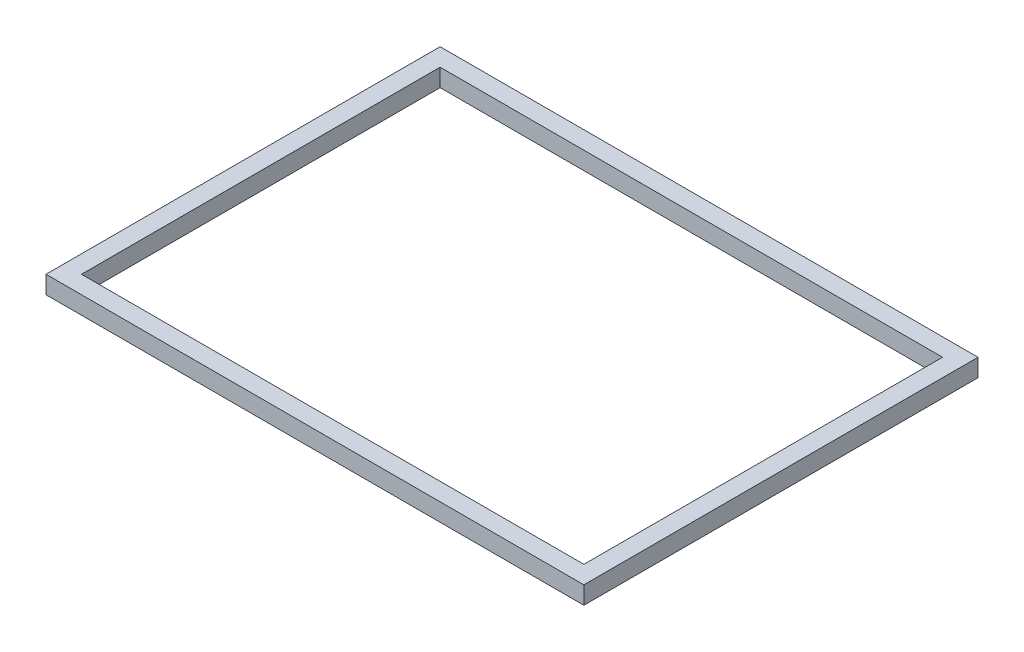
ISO-10303-21;
HEADER;
FILE_DESCRIPTION(('STEP AP214'),'2;1');
FILE_NAME('part.step','',(''),(''),'','','');
FILE_SCHEMA(('AUTOMOTIVE_DESIGN { 1 0 10303 214 1 1 1 1 }'));
ENDSEC;
DATA;
#1=APPLICATION_CONTEXT('core data for automotive mechanical design processes');
#2=APPLICATION_PROTOCOL_DEFINITION('international standard','automotive_design',2000,#1);
#3=PRODUCT_CONTEXT('',#1,'mechanical');
#4=PRODUCT('Part','Part','',(#3));
#5=PRODUCT_RELATED_PRODUCT_CATEGORY('part','',(#4));
#6=PRODUCT_DEFINITION_FORMATION('','',#4);
#7=PRODUCT_DEFINITION_CONTEXT('part definition',#1,'design');
#8=PRODUCT_DEFINITION('design','',#6,#7);
#9=PRODUCT_DEFINITION_SHAPE('','',#8);
#10=(LENGTH_UNIT() NAMED_UNIT(*) SI_UNIT(.MILLI.,.METRE.));
#11=(NAMED_UNIT(*) PLANE_ANGLE_UNIT() SI_UNIT($,.RADIAN.));
#12=(NAMED_UNIT(*) SI_UNIT($,.STERADIAN.) SOLID_ANGLE_UNIT());
#13=UNCERTAINTY_MEASURE_WITH_UNIT(LENGTH_MEASURE(1.E-05),#10,'distance_accuracy_value','');
#14=(GEOMETRIC_REPRESENTATION_CONTEXT(3) GLOBAL_UNCERTAINTY_ASSIGNED_CONTEXT((#13)) GLOBAL_UNIT_ASSIGNED_CONTEXT((#10,
#11,#12)) REPRESENTATION_CONTEXT('',''));
#15=CARTESIAN_POINT('',(0.,0.,0.));
#16=DIRECTION('',(0.,0.,1.));
#17=DIRECTION('',(1.,0.,0.));
#18=AXIS2_PLACEMENT_3D('',#15,#16,#17);
#19=CARTESIAN_POINT('',(0.,30.1625,0.));
#20=DIRECTION('',(0.,1.,0.));
#21=DIRECTION('',(0.,0.,1.));
#22=AXIS2_PLACEMENT_3D('',#19,#20,#21);
#23=PLANE('',#22);
#24=DIRECTION('',(0.,0.,-1.));
#25=VECTOR('',#24,1.);
#26=CARTESIAN_POINT('',(457.2,30.1625,-335.));
#27=LINE('',#26,#25);
#28=CARTESIAN_POINT('',(457.2,30.1625,335.));
#29=VERTEX_POINT('',#28);
#30=CARTESIAN_POINT('',(457.2,30.1625,-335.));
#31=VERTEX_POINT('',#30);
#32=EDGE_CURVE('E136',#29,#31,#27,.T.);
#33=ORIENTED_EDGE('',*,*,#32,.T.);
#34=DIRECTION('',(-1.,0.,0.));
#35=VECTOR('',#34,1.);
#36=CARTESIAN_POINT('',(-457.2,30.1625,-335.));
#37=LINE('',#36,#35);
#38=CARTESIAN_POINT('',(-457.2,30.1625,-335.));
#39=VERTEX_POINT('',#38);
#40=EDGE_CURVE('E139',#31,#39,#37,.T.);
#41=ORIENTED_EDGE('',*,*,#40,.T.);
#42=DIRECTION('',(0.,0.,1.));
#43=VECTOR('',#42,1.);
#44=CARTESIAN_POINT('',(-457.2,30.1625,-335.));
#45=LINE('',#44,#43);
#46=CARTESIAN_POINT('',(-457.2,30.1625,335.));
#47=VERTEX_POINT('',#46);
#48=EDGE_CURVE('E142',#39,#47,#45,.T.);
#49=ORIENTED_EDGE('',*,*,#48,.T.);
#50=DIRECTION('',(1.,0.,0.));
#51=VECTOR('',#50,1.);
#52=CARTESIAN_POINT('',(-457.2,30.1625,335.));
#53=LINE('',#52,#51);
#54=EDGE_CURVE('E144',#47,#29,#53,.T.);
#55=ORIENTED_EDGE('',*,*,#54,.T.);
#56=EDGE_LOOP('',(#33,#41,#49,#55));
#57=FACE_BOUND('',#56,.T.);
#58=DIRECTION('',(-1.,0.,0.));
#59=VECTOR('',#58,1.);
#60=CARTESIAN_POINT('',(-427.0375,30.1625,-304.8375));
#61=LINE('',#60,#59);
#62=CARTESIAN_POINT('',(427.0375,30.1625,-304.8375));
#63=VERTEX_POINT('',#62);
#64=CARTESIAN_POINT('',(-427.0375,30.1625,-304.8375));
#65=VERTEX_POINT('',#64);
#66=EDGE_CURVE('E108',#63,#65,#61,.T.);
#67=ORIENTED_EDGE('',*,*,#66,.F.);
#68=DIRECTION('',(0.,0.,-1.));
#69=VECTOR('',#68,1.);
#70=CARTESIAN_POINT('',(427.0375,30.1625,-304.8375));
#71=LINE('',#70,#69);
#72=CARTESIAN_POINT('',(427.0375,30.1625,304.8375));
#73=VERTEX_POINT('',#72);
#74=EDGE_CURVE('E100',#73,#63,#71,.T.);
#75=ORIENTED_EDGE('',*,*,#74,.F.);
#76=DIRECTION('',(1.,0.,0.));
#77=VECTOR('',#76,1.);
#78=CARTESIAN_POINT('',(-427.0375,30.1625,304.8375));
#79=LINE('',#78,#77);
#80=CARTESIAN_POINT('',(-427.0375,30.1625,304.8375));
#81=VERTEX_POINT('',#80);
#82=EDGE_CURVE('E122',#81,#73,#79,.T.);
#83=ORIENTED_EDGE('',*,*,#82,.F.);
#84=DIRECTION('',(0.,0.,1.));
#85=VECTOR('',#84,1.);
#86=CARTESIAN_POINT('',(-427.0375,30.1625,-304.8375));
#87=LINE('',#86,#85);
#88=EDGE_CURVE('E120',#65,#81,#87,.T.);
#89=ORIENTED_EDGE('',*,*,#88,.F.);
#90=EDGE_LOOP('',(#67,#75,#83,#89));
#91=FACE_BOUND('',#90,.T.);
#92=ADVANCED_FACE('F35',(#57,#91),#23,.T.);
#93=CARTESIAN_POINT('',(0.,0.,0.));
#94=DIRECTION('',(0.,1.,0.));
#95=DIRECTION('',(0.,0.,1.));
#96=AXIS2_PLACEMENT_3D('',#93,#94,#95);
#97=PLANE('',#96);
#98=DIRECTION('',(0.,0.,-1.));
#99=VECTOR('',#98,1.);
#100=CARTESIAN_POINT('',(457.2,0.,-335.));
#101=LINE('',#100,#99);
#102=CARTESIAN_POINT('',(457.2,0.,335.));
#103=VERTEX_POINT('',#102);
#104=CARTESIAN_POINT('',(457.2,0.,-335.));
#105=VERTEX_POINT('',#104);
#106=EDGE_CURVE('E116',#103,#105,#101,.T.);
#107=ORIENTED_EDGE('',*,*,#106,.F.);
#108=DIRECTION('',(1.,0.,0.));
#109=VECTOR('',#108,1.);
#110=CARTESIAN_POINT('',(-457.2,0.,335.));
#111=LINE('',#110,#109);
#112=CARTESIAN_POINT('',(-457.2,0.,335.));
#113=VERTEX_POINT('',#112);
#114=EDGE_CURVE('E140',#113,#103,#111,.T.);
#115=ORIENTED_EDGE('',*,*,#114,.F.);
#116=DIRECTION('',(0.,0.,1.));
#117=VECTOR('',#116,1.);
#118=CARTESIAN_POINT('',(-457.2,0.,-335.));
#119=LINE('',#118,#117);
#120=CARTESIAN_POINT('',(-457.2,0.,-335.));
#121=VERTEX_POINT('',#120);
#122=EDGE_CURVE('E151',#121,#113,#119,.T.);
#123=ORIENTED_EDGE('',*,*,#122,.F.);
#124=DIRECTION('',(-1.,0.,0.));
#125=VECTOR('',#124,1.);
#126=CARTESIAN_POINT('',(-457.2,0.,-335.));
#127=LINE('',#126,#125);
#128=EDGE_CURVE('E149',#105,#121,#127,.T.);
#129=ORIENTED_EDGE('',*,*,#128,.F.);
#130=EDGE_LOOP('',(#107,#115,#123,#129));
#131=FACE_BOUND('',#130,.T.);
#132=DIRECTION('',(0.,0.,-1.));
#133=VECTOR('',#132,1.);
#134=CARTESIAN_POINT('',(427.0375,0.,-304.8375));
#135=LINE('',#134,#133);
#136=CARTESIAN_POINT('',(427.0375,0.,304.8375));
#137=VERTEX_POINT('',#136);
#138=CARTESIAN_POINT('',(427.0375,0.,-304.8375));
#139=VERTEX_POINT('',#138);
#140=EDGE_CURVE('E58',#137,#139,#135,.T.);
#141=ORIENTED_EDGE('',*,*,#140,.T.);
#142=DIRECTION('',(-1.,0.,0.));
#143=VECTOR('',#142,1.);
#144=CARTESIAN_POINT('',(-427.0375,0.,-304.8375));
#145=LINE('',#144,#143);
#146=CARTESIAN_POINT('',(-427.0375,0.,-304.8375));
#147=VERTEX_POINT('',#146);
#148=EDGE_CURVE('E115',#139,#147,#145,.T.);
#149=ORIENTED_EDGE('',*,*,#148,.T.);
#150=DIRECTION('',(0.,0.,1.));
#151=VECTOR('',#150,1.);
#152=CARTESIAN_POINT('',(-427.0375,0.,-304.8375));
#153=LINE('',#152,#151);
#154=CARTESIAN_POINT('',(-427.0375,0.,304.8375));
#155=VERTEX_POINT('',#154);
#156=EDGE_CURVE('E128',#147,#155,#153,.T.);
#157=ORIENTED_EDGE('',*,*,#156,.T.);
#158=DIRECTION('',(1.,0.,0.));
#159=VECTOR('',#158,1.);
#160=CARTESIAN_POINT('',(-427.0375,0.,304.8375));
#161=LINE('',#160,#159);
#162=EDGE_CURVE('E109',#155,#137,#161,.T.);
#163=ORIENTED_EDGE('',*,*,#162,.T.);
#164=EDGE_LOOP('',(#141,#149,#157,#163));
#165=FACE_BOUND('',#164,.T.);
#166=ADVANCED_FACE('F169',(#131,#165),#97,.F.);
#167=CARTESIAN_POINT('',(457.2,30.1625,-335.));
#168=DIRECTION('',(-1.,0.,0.));
#169=DIRECTION('',(0.,0.,1.));
#170=AXIS2_PLACEMENT_3D('',#167,#168,#169);
#171=PLANE('',#170);
#172=ORIENTED_EDGE('',*,*,#106,.T.);
#173=DIRECTION('',(0.,-1.,0.));
#174=VECTOR('',#173,1.);
#175=CARTESIAN_POINT('',(457.2,30.1625,-335.));
#176=LINE('',#175,#174);
#177=EDGE_CURVE('E11',#31,#105,#176,.T.);
#178=ORIENTED_EDGE('',*,*,#177,.F.);
#179=ORIENTED_EDGE('',*,*,#32,.F.);
#180=DIRECTION('',(0.,-1.,0.));
#181=VECTOR('',#180,1.);
#182=CARTESIAN_POINT('',(457.2,30.1625,335.));
#183=LINE('',#182,#181);
#184=EDGE_CURVE('E146',#29,#103,#183,.T.);
#185=ORIENTED_EDGE('',*,*,#184,.T.);
#186=EDGE_LOOP('',(#172,#178,#179,#185));
#187=FACE_BOUND('',#186,.T.);
#188=ADVANCED_FACE('F37',(#187),#171,.F.);
#189=CARTESIAN_POINT('',(-457.2,30.1625,-335.));
#190=DIRECTION('',(0.,0.,1.));
#191=DIRECTION('',(1.,0.,0.));
#192=AXIS2_PLACEMENT_3D('',#189,#190,#191);
#193=PLANE('',#192);
#194=ORIENTED_EDGE('',*,*,#128,.T.);
#195=DIRECTION('',(0.,-1.,0.));
#196=VECTOR('',#195,1.);
#197=CARTESIAN_POINT('',(-457.2,30.1625,-335.));
#198=LINE('',#197,#196);
#199=EDGE_CURVE('E43',#39,#121,#198,.T.);
#200=ORIENTED_EDGE('',*,*,#199,.F.);
#201=ORIENTED_EDGE('',*,*,#40,.F.);
#202=ORIENTED_EDGE('',*,*,#177,.T.);
#203=EDGE_LOOP('',(#194,#200,#201,#202));
#204=FACE_BOUND('',#203,.T.);
#205=ADVANCED_FACE('F179',(#204),#193,.F.);
#206=CARTESIAN_POINT('',(-457.2,30.1625,-335.));
#207=DIRECTION('',(1.,0.,0.));
#208=DIRECTION('',(0.,0.,-1.));
#209=AXIS2_PLACEMENT_3D('',#206,#207,#208);
#210=PLANE('',#209);
#211=ORIENTED_EDGE('',*,*,#122,.T.);
#212=DIRECTION('',(0.,-1.,0.));
#213=VECTOR('',#212,1.);
#214=CARTESIAN_POINT('',(-457.2,30.1625,335.));
#215=LINE('',#214,#213);
#216=EDGE_CURVE('E156',#47,#113,#215,.T.);
#217=ORIENTED_EDGE('',*,*,#216,.F.);
#218=ORIENTED_EDGE('',*,*,#48,.F.);
#219=ORIENTED_EDGE('',*,*,#199,.T.);
#220=EDGE_LOOP('',(#211,#217,#218,#219));
#221=FACE_BOUND('',#220,.T.);
#222=ADVANCED_FACE('F163',(#221),#210,.F.);
#223=CARTESIAN_POINT('',(-457.2,30.1625,335.));
#224=DIRECTION('',(0.,0.,-1.));
#225=DIRECTION('',(-1.,0.,0.));
#226=AXIS2_PLACEMENT_3D('',#223,#224,#225);
#227=PLANE('',#226);
#228=ORIENTED_EDGE('',*,*,#114,.T.);
#229=ORIENTED_EDGE('',*,*,#184,.F.);
#230=ORIENTED_EDGE('',*,*,#54,.F.);
#231=ORIENTED_EDGE('',*,*,#216,.T.);
#232=EDGE_LOOP('',(#228,#229,#230,#231));
#233=FACE_BOUND('',#232,.T.);
#234=ADVANCED_FACE('F173',(#233),#227,.F.);
#235=CARTESIAN_POINT('',(427.0375,30.1625,-304.8375));
#236=DIRECTION('',(-1.,0.,0.));
#237=DIRECTION('',(0.,0.,1.));
#238=AXIS2_PLACEMENT_3D('',#235,#236,#237);
#239=PLANE('',#238);
#240=ORIENTED_EDGE('',*,*,#140,.F.);
#241=DIRECTION('',(0.,-1.,0.));
#242=VECTOR('',#241,1.);
#243=CARTESIAN_POINT('',(427.0375,30.1625,304.8375));
#244=LINE('',#243,#242);
#245=EDGE_CURVE('E104',#73,#137,#244,.T.);
#246=ORIENTED_EDGE('',*,*,#245,.F.);
#247=ORIENTED_EDGE('',*,*,#74,.T.);
#248=DIRECTION('',(0.,-1.,0.));
#249=VECTOR('',#248,1.);
#250=CARTESIAN_POINT('',(427.0375,30.1625,-304.8375));
#251=LINE('',#250,#249);
#252=EDGE_CURVE('E103',#63,#139,#251,.T.);
#253=ORIENTED_EDGE('',*,*,#252,.T.);
#254=EDGE_LOOP('',(#240,#246,#247,#253));
#255=FACE_BOUND('',#254,.T.);
#256=ADVANCED_FACE('F102',(#255),#239,.T.);
#257=CARTESIAN_POINT('',(-427.0375,30.1625,-304.8375));
#258=DIRECTION('',(0.,0.,1.));
#259=DIRECTION('',(1.,0.,0.));
#260=AXIS2_PLACEMENT_3D('',#257,#258,#259);
#261=PLANE('',#260);
#262=ORIENTED_EDGE('',*,*,#148,.F.);
#263=ORIENTED_EDGE('',*,*,#252,.F.);
#264=ORIENTED_EDGE('',*,*,#66,.T.);
#265=DIRECTION('',(0.,-1.,0.));
#266=VECTOR('',#265,1.);
#267=CARTESIAN_POINT('',(-427.0375,30.1625,-304.8375));
#268=LINE('',#267,#266);
#269=EDGE_CURVE('E117',#65,#147,#268,.T.);
#270=ORIENTED_EDGE('',*,*,#269,.T.);
#271=EDGE_LOOP('',(#262,#263,#264,#270));
#272=FACE_BOUND('',#271,.T.);
#273=ADVANCED_FACE('F112',(#272),#261,.T.);
#274=CARTESIAN_POINT('',(-427.0375,30.1625,-304.8375));
#275=DIRECTION('',(1.,0.,0.));
#276=DIRECTION('',(0.,0.,-1.));
#277=AXIS2_PLACEMENT_3D('',#274,#275,#276);
#278=PLANE('',#277);
#279=ORIENTED_EDGE('',*,*,#156,.F.);
#280=ORIENTED_EDGE('',*,*,#269,.F.);
#281=ORIENTED_EDGE('',*,*,#88,.T.);
#282=DIRECTION('',(0.,-1.,0.));
#283=VECTOR('',#282,1.);
#284=CARTESIAN_POINT('',(-427.0375,30.1625,304.8375));
#285=LINE('',#284,#283);
#286=EDGE_CURVE('E50',#81,#155,#285,.T.);
#287=ORIENTED_EDGE('',*,*,#286,.T.);
#288=EDGE_LOOP('',(#279,#280,#281,#287));
#289=FACE_BOUND('',#288,.T.);
#290=ADVANCED_FACE('F202',(#289),#278,.T.);
#291=CARTESIAN_POINT('',(-427.0375,30.1625,304.8375));
#292=DIRECTION('',(0.,0.,-1.));
#293=DIRECTION('',(-1.,0.,0.));
#294=AXIS2_PLACEMENT_3D('',#291,#292,#293);
#295=PLANE('',#294);
#296=ORIENTED_EDGE('',*,*,#162,.F.);
#297=ORIENTED_EDGE('',*,*,#286,.F.);
#298=ORIENTED_EDGE('',*,*,#82,.T.);
#299=ORIENTED_EDGE('',*,*,#245,.T.);
#300=EDGE_LOOP('',(#296,#297,#298,#299));
#301=FACE_BOUND('',#300,.T.);
#302=ADVANCED_FACE('F206',(#301),#295,.T.);
#303=CLOSED_SHELL('',(#92,#166,#188,#205,#222,#234,#256,#273,#290,#302));
#304=MANIFOLD_SOLID_BREP('B2',#303);
#305=ADVANCED_BREP_SHAPE_REPRESENTATION('',(#18,#304),#14);
#306=SHAPE_DEFINITION_REPRESENTATION(#9,#305);
ENDSEC;
END-ISO-10303-21;
